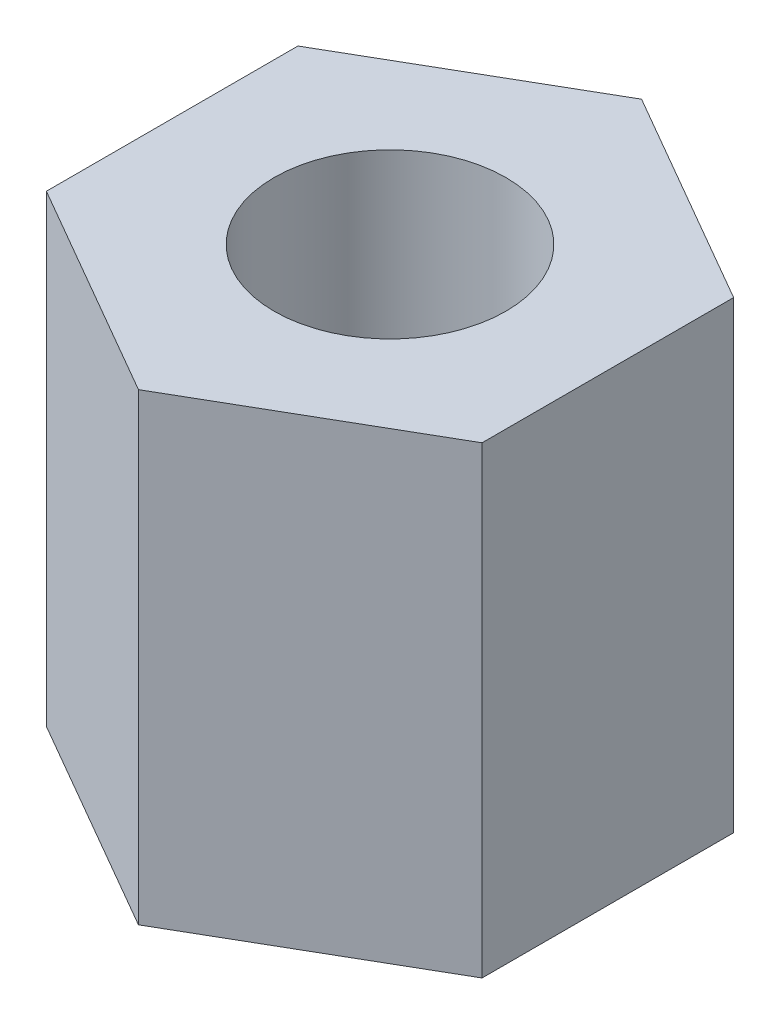
ISO-10303-21;
HEADER;
FILE_DESCRIPTION(('STEP AP214'),'2;1');
FILE_NAME('part.step','',(''),(''),'','','');
FILE_SCHEMA(('AUTOMOTIVE_DESIGN { 1 0 10303 214 1 1 1 1 }'));
ENDSEC;
DATA;
#1=APPLICATION_CONTEXT('core data for automotive mechanical design processes');
#2=APPLICATION_PROTOCOL_DEFINITION('international standard','automotive_design',2000,#1);
#3=PRODUCT_CONTEXT('',#1,'mechanical');
#4=PRODUCT('Part','Part','',(#3));
#5=PRODUCT_RELATED_PRODUCT_CATEGORY('part','',(#4));
#6=PRODUCT_DEFINITION_FORMATION('','',#4);
#7=PRODUCT_DEFINITION_CONTEXT('part definition',#1,'design');
#8=PRODUCT_DEFINITION('design','',#6,#7);
#9=PRODUCT_DEFINITION_SHAPE('','',#8);
#10=(LENGTH_UNIT() NAMED_UNIT(*) SI_UNIT(.MILLI.,.METRE.));
#11=(NAMED_UNIT(*) PLANE_ANGLE_UNIT() SI_UNIT($,.RADIAN.));
#12=(NAMED_UNIT(*) SI_UNIT($,.STERADIAN.) SOLID_ANGLE_UNIT());
#13=UNCERTAINTY_MEASURE_WITH_UNIT(LENGTH_MEASURE(1.E-05),#10,'distance_accuracy_value','');
#14=(GEOMETRIC_REPRESENTATION_CONTEXT(3) GLOBAL_UNCERTAINTY_ASSIGNED_CONTEXT((#13)) GLOBAL_UNIT_ASSIGNED_CONTEXT((#10,
#11,#12)) REPRESENTATION_CONTEXT('',''));
#15=CARTESIAN_POINT('',(0.,0.,0.));
#16=DIRECTION('',(0.,0.,1.));
#17=DIRECTION('',(1.,0.,0.));
#18=AXIS2_PLACEMENT_3D('',#15,#16,#17);
#19=CARTESIAN_POINT('',(0.,5.,0.));
#20=DIRECTION('',(0.,1.,0.));
#21=DIRECTION('',(0.,0.,1.));
#22=AXIS2_PLACEMENT_3D('',#19,#20,#21);
#23=PLANE('',#22);
#24=DIRECTION('',(-0.866025403784441,0.,-0.499999999999995));
#25=VECTOR('',#24,1.);
#26=CARTESIAN_POINT('',(2.34999999999998,5.,-1.35677313259565));
#27=LINE('',#26,#25);
#28=CARTESIAN_POINT('',(2.34999999999998,5.,-1.35677313259565));
#29=VERTEX_POINT('',#28);
#30=CARTESIAN_POINT('',(0.,5.,-2.71354626519124));
#31=VERTEX_POINT('',#30);
#32=EDGE_CURVE('E139',#29,#31,#27,.T.);
#33=ORIENTED_EDGE('',*,*,#32,.T.);
#34=DIRECTION('',(-0.866025403784438,0.,0.500000000000001));
#35=VECTOR('',#34,1.);
#36=CARTESIAN_POINT('',(0.,5.,-2.71354626519124));
#37=LINE('',#36,#35);
#38=CARTESIAN_POINT('',(-2.35,5.,-1.35677313259562));
#39=VERTEX_POINT('',#38);
#40=EDGE_CURVE('E97',#31,#39,#37,.T.);
#41=ORIENTED_EDGE('',*,*,#40,.T.);
#42=DIRECTION('',(0.,0.,1.));
#43=VECTOR('',#42,1.);
#44=CARTESIAN_POINT('',(-2.35,5.,-1.35677313259562));
#45=LINE('',#44,#43);
#46=CARTESIAN_POINT('',(-2.34999999999999,5.,1.35677313259563));
#47=VERTEX_POINT('',#46);
#48=EDGE_CURVE('E110',#39,#47,#45,.T.);
#49=ORIENTED_EDGE('',*,*,#48,.T.);
#50=DIRECTION('',(0.866025403784442,0.,0.499999999999995));
#51=VECTOR('',#50,1.);
#52=CARTESIAN_POINT('',(-2.34999999999999,5.,1.35677313259563));
#53=LINE('',#52,#51);
#54=CARTESIAN_POINT('',(0.,5.,2.71354626519124));
#55=VERTEX_POINT('',#54);
#56=EDGE_CURVE('E104',#47,#55,#53,.T.);
#57=ORIENTED_EDGE('',*,*,#56,.T.);
#58=DIRECTION('',(0.866025403784435,0.,-0.500000000000007));
#59=VECTOR('',#58,1.);
#60=CARTESIAN_POINT('',(0.,5.,2.71354626519124));
#61=LINE('',#60,#59);
#62=CARTESIAN_POINT('',(2.35000000000001,5.,1.3567731325956));
#63=VERTEX_POINT('',#62);
#64=EDGE_CURVE('E108',#55,#63,#61,.T.);
#65=ORIENTED_EDGE('',*,*,#64,.T.);
#66=DIRECTION('',(0.,0.,-1.));
#67=VECTOR('',#66,1.);
#68=CARTESIAN_POINT('',(2.35000000000001,5.,1.3567731325956));
#69=LINE('',#68,#67);
#70=EDGE_CURVE('E60',#63,#29,#69,.T.);
#71=ORIENTED_EDGE('',*,*,#70,.T.);
#72=EDGE_LOOP('',(#33,#41,#49,#57,#65,#71));
#73=FACE_BOUND('',#72,.T.);
#74=CARTESIAN_POINT('',(0.,5.,0.));
#75=DIRECTION('',(0.,1.,0.));
#76=DIRECTION('',(0.,0.,1.));
#77=AXIS2_PLACEMENT_3D('',#74,#75,#76);
#78=CIRCLE('',#77,1.25);
#79=CARTESIAN_POINT('',(0.,5.,1.25));
#80=VERTEX_POINT('',#79);
#81=EDGE_CURVE('E132',#80,#80,#78,.T.);
#82=ORIENTED_EDGE('',*,*,#81,.F.);
#83=EDGE_LOOP('',(#82));
#84=FACE_BOUND('',#83,.T.);
#85=ADVANCED_FACE('F43',(#73,#84),#23,.T.);
#86=CARTESIAN_POINT('',(0.,0.,0.));
#87=DIRECTION('',(0.,1.,0.));
#88=DIRECTION('',(0.,0.,1.));
#89=AXIS2_PLACEMENT_3D('',#86,#87,#88);
#90=PLANE('',#89);
#91=DIRECTION('',(-0.866025403784441,0.,-0.499999999999995));
#92=VECTOR('',#91,1.);
#93=CARTESIAN_POINT('',(2.34999999999998,0.,-1.35677313259565));
#94=LINE('',#93,#92);
#95=CARTESIAN_POINT('',(2.34999999999998,0.,-1.35677313259565));
#96=VERTEX_POINT('',#95);
#97=CARTESIAN_POINT('',(0.,0.,-2.71354626519124));
#98=VERTEX_POINT('',#97);
#99=EDGE_CURVE('E128',#96,#98,#94,.T.);
#100=ORIENTED_EDGE('',*,*,#99,.F.);
#101=DIRECTION('',(0.,0.,-1.));
#102=VECTOR('',#101,1.);
#103=CARTESIAN_POINT('',(2.35000000000001,0.,1.3567731325956));
#104=LINE('',#103,#102);
#105=CARTESIAN_POINT('',(2.35000000000001,0.,1.3567731325956));
#106=VERTEX_POINT('',#105);
#107=EDGE_CURVE('E89',#106,#96,#104,.T.);
#108=ORIENTED_EDGE('',*,*,#107,.F.);
#109=DIRECTION('',(0.866025403784435,0.,-0.500000000000007));
#110=VECTOR('',#109,1.);
#111=CARTESIAN_POINT('',(0.,0.,2.71354626519124));
#112=LINE('',#111,#110);
#113=CARTESIAN_POINT('',(0.,0.,2.71354626519124));
#114=VERTEX_POINT('',#113);
#115=EDGE_CURVE('E83',#114,#106,#112,.T.);
#116=ORIENTED_EDGE('',*,*,#115,.F.);
#117=DIRECTION('',(0.866025403784442,0.,0.499999999999995));
#118=VECTOR('',#117,1.);
#119=CARTESIAN_POINT('',(-2.34999999999999,0.,1.35677313259563));
#120=LINE('',#119,#118);
#121=CARTESIAN_POINT('',(-2.34999999999999,0.,1.35677313259563));
#122=VERTEX_POINT('',#121);
#123=EDGE_CURVE('E118',#122,#114,#120,.T.);
#124=ORIENTED_EDGE('',*,*,#123,.F.);
#125=DIRECTION('',(0.,0.,1.));
#126=VECTOR('',#125,1.);
#127=CARTESIAN_POINT('',(-2.35,0.,-1.35677313259562));
#128=LINE('',#127,#126);
#129=CARTESIAN_POINT('',(-2.35,0.,-1.35677313259562));
#130=VERTEX_POINT('',#129);
#131=EDGE_CURVE('E134',#130,#122,#128,.T.);
#132=ORIENTED_EDGE('',*,*,#131,.F.);
#133=DIRECTION('',(-0.866025403784438,0.,0.500000000000001));
#134=VECTOR('',#133,1.);
#135=CARTESIAN_POINT('',(0.,0.,-2.71354626519124));
#136=LINE('',#135,#134);
#137=EDGE_CURVE('E131',#98,#130,#136,.T.);
#138=ORIENTED_EDGE('',*,*,#137,.F.);
#139=EDGE_LOOP('',(#100,#108,#116,#124,#132,#138));
#140=FACE_BOUND('',#139,.T.);
#141=CARTESIAN_POINT('',(0.,0.,0.));
#142=DIRECTION('',(0.,1.,0.));
#143=DIRECTION('',(0.,0.,1.));
#144=AXIS2_PLACEMENT_3D('',#141,#142,#143);
#145=CIRCLE('',#144,1.25);
#146=CARTESIAN_POINT('',(0.,0.,1.25));
#147=VERTEX_POINT('',#146);
#148=EDGE_CURVE('E232',#147,#147,#145,.T.);
#149=ORIENTED_EDGE('',*,*,#148,.T.);
#150=EDGE_LOOP('',(#149));
#151=FACE_BOUND('',#150,.T.);
#152=ADVANCED_FACE('F148',(#140,#151),#90,.F.);
#153=CARTESIAN_POINT('',(2.34999999999998,5.,-1.35677313259565));
#154=DIRECTION('',(-0.499999999999995,0.,0.866025403784442));
#155=DIRECTION('',(0.866025403784442,0.,0.499999999999995));
#156=AXIS2_PLACEMENT_3D('',#153,#154,#155);
#157=PLANE('',#156);
#158=ORIENTED_EDGE('',*,*,#99,.T.);
#159=DIRECTION('',(0.,-1.,0.));
#160=VECTOR('',#159,1.);
#161=CARTESIAN_POINT('',(0.,5.,-2.71354626519124));
#162=LINE('',#161,#160);
#163=EDGE_CURVE('E11',#31,#98,#162,.T.);
#164=ORIENTED_EDGE('',*,*,#163,.F.);
#165=ORIENTED_EDGE('',*,*,#32,.F.);
#166=DIRECTION('',(0.,-1.,0.));
#167=VECTOR('',#166,1.);
#168=CARTESIAN_POINT('',(2.34999999999998,5.,-1.35677313259565));
#169=LINE('',#168,#167);
#170=EDGE_CURVE('E124',#29,#96,#169,.T.);
#171=ORIENTED_EDGE('',*,*,#170,.T.);
#172=EDGE_LOOP('',(#158,#164,#165,#171));
#173=FACE_BOUND('',#172,.T.);
#174=ADVANCED_FACE('F45',(#173),#157,.F.);
#175=CARTESIAN_POINT('',(0.,5.,-2.71354626519124));
#176=DIRECTION('',(0.500000000000001,0.,0.866025403784438));
#177=DIRECTION('',(0.866025403784438,0.,-0.500000000000001));
#178=AXIS2_PLACEMENT_3D('',#175,#176,#177);
#179=PLANE('',#178);
#180=ORIENTED_EDGE('',*,*,#137,.T.);
#181=DIRECTION('',(0.,-1.,0.));
#182=VECTOR('',#181,1.);
#183=CARTESIAN_POINT('',(-2.35,5.,-1.35677313259562));
#184=LINE('',#183,#182);
#185=EDGE_CURVE('E52',#39,#130,#184,.T.);
#186=ORIENTED_EDGE('',*,*,#185,.F.);
#187=ORIENTED_EDGE('',*,*,#40,.F.);
#188=ORIENTED_EDGE('',*,*,#163,.T.);
#189=EDGE_LOOP('',(#180,#186,#187,#188));
#190=FACE_BOUND('',#189,.T.);
#191=ADVANCED_FACE('F173',(#190),#179,.F.);
#192=CARTESIAN_POINT('',(-2.35,5.,-1.35677313259562));
#193=DIRECTION('',(1.,0.,0.));
#194=DIRECTION('',(0.,0.,-1.));
#195=AXIS2_PLACEMENT_3D('',#192,#193,#194);
#196=PLANE('',#195);
#197=ORIENTED_EDGE('',*,*,#131,.T.);
#198=DIRECTION('',(0.,-1.,0.));
#199=VECTOR('',#198,1.);
#200=CARTESIAN_POINT('',(-2.34999999999999,5.,1.35677313259563));
#201=LINE('',#200,#199);
#202=EDGE_CURVE('E119',#47,#122,#201,.T.);
#203=ORIENTED_EDGE('',*,*,#202,.F.);
#204=ORIENTED_EDGE('',*,*,#48,.F.);
#205=ORIENTED_EDGE('',*,*,#185,.T.);
#206=EDGE_LOOP('',(#197,#203,#204,#205));
#207=FACE_BOUND('',#206,.T.);
#208=ADVANCED_FACE('F145',(#207),#196,.F.);
#209=CARTESIAN_POINT('',(-2.34999999999999,5.,1.35677313259563));
#210=DIRECTION('',(0.499999999999995,0.,-0.866025403784442));
#211=DIRECTION('',(-0.866025403784442,0.,-0.499999999999995));
#212=AXIS2_PLACEMENT_3D('',#209,#210,#211);
#213=PLANE('',#212);
#214=ORIENTED_EDGE('',*,*,#123,.T.);
#215=DIRECTION('',(0.,-1.,0.));
#216=VECTOR('',#215,1.);
#217=CARTESIAN_POINT('',(0.,5.,2.71354626519124));
#218=LINE('',#217,#216);
#219=EDGE_CURVE('E115',#55,#114,#218,.T.);
#220=ORIENTED_EDGE('',*,*,#219,.F.);
#221=ORIENTED_EDGE('',*,*,#56,.F.);
#222=ORIENTED_EDGE('',*,*,#202,.T.);
#223=EDGE_LOOP('',(#214,#220,#221,#222));
#224=FACE_BOUND('',#223,.T.);
#225=ADVANCED_FACE('F116',(#224),#213,.F.);
#226=CARTESIAN_POINT('',(0.,5.,2.71354626519124));
#227=DIRECTION('',(-0.500000000000007,0.,-0.866025403784434));
#228=DIRECTION('',(-0.866025403784435,0.,0.500000000000007));
#229=AXIS2_PLACEMENT_3D('',#226,#227,#228);
#230=PLANE('',#229);
#231=ORIENTED_EDGE('',*,*,#115,.T.);
#232=DIRECTION('',(0.,-1.,0.));
#233=VECTOR('',#232,1.);
#234=CARTESIAN_POINT('',(2.35000000000001,5.,1.3567731325956));
#235=LINE('',#234,#233);
#236=EDGE_CURVE('E120',#63,#106,#235,.T.);
#237=ORIENTED_EDGE('',*,*,#236,.F.);
#238=ORIENTED_EDGE('',*,*,#64,.F.);
#239=ORIENTED_EDGE('',*,*,#219,.T.);
#240=EDGE_LOOP('',(#231,#237,#238,#239));
#241=FACE_BOUND('',#240,.T.);
#242=ADVANCED_FACE('F122',(#241),#230,.F.);
#243=CARTESIAN_POINT('',(2.35000000000001,5.,1.3567731325956));
#244=DIRECTION('',(-1.,0.,0.));
#245=DIRECTION('',(0.,0.,1.));
#246=AXIS2_PLACEMENT_3D('',#243,#244,#245);
#247=PLANE('',#246);
#248=ORIENTED_EDGE('',*,*,#107,.T.);
#249=ORIENTED_EDGE('',*,*,#170,.F.);
#250=ORIENTED_EDGE('',*,*,#70,.F.);
#251=ORIENTED_EDGE('',*,*,#236,.T.);
#252=EDGE_LOOP('',(#248,#249,#250,#251));
#253=FACE_BOUND('',#252,.T.);
#254=ADVANCED_FACE('F153',(#253),#247,.F.);
#255=CARTESIAN_POINT('',(0.,5.,0.));
#256=DIRECTION('',(0.,-1.,0.));
#257=DIRECTION('',(0.,0.,-1.));
#258=AXIS2_PLACEMENT_3D('',#255,#256,#257);
#259=CYLINDRICAL_SURFACE('',#258,1.25);
#260=ORIENTED_EDGE('',*,*,#81,.T.);
#261=EDGE_LOOP('',(#260));
#262=FACE_BOUND('',#261,.T.);
#263=ORIENTED_EDGE('',*,*,#148,.F.);
#264=EDGE_LOOP('',(#263));
#265=FACE_BOUND('',#264,.T.);
#266=ADVANCED_FACE('F155',(#262,#265),#259,.F.);
#267=CLOSED_SHELL('',(#85,#152,#174,#191,#208,#225,#242,#254,#266));
#268=MANIFOLD_SOLID_BREP('B2',#267);
#269=ADVANCED_BREP_SHAPE_REPRESENTATION('',(#18,#268),#14);
#270=SHAPE_DEFINITION_REPRESENTATION(#9,#269);
ENDSEC;
END-ISO-10303-21;
